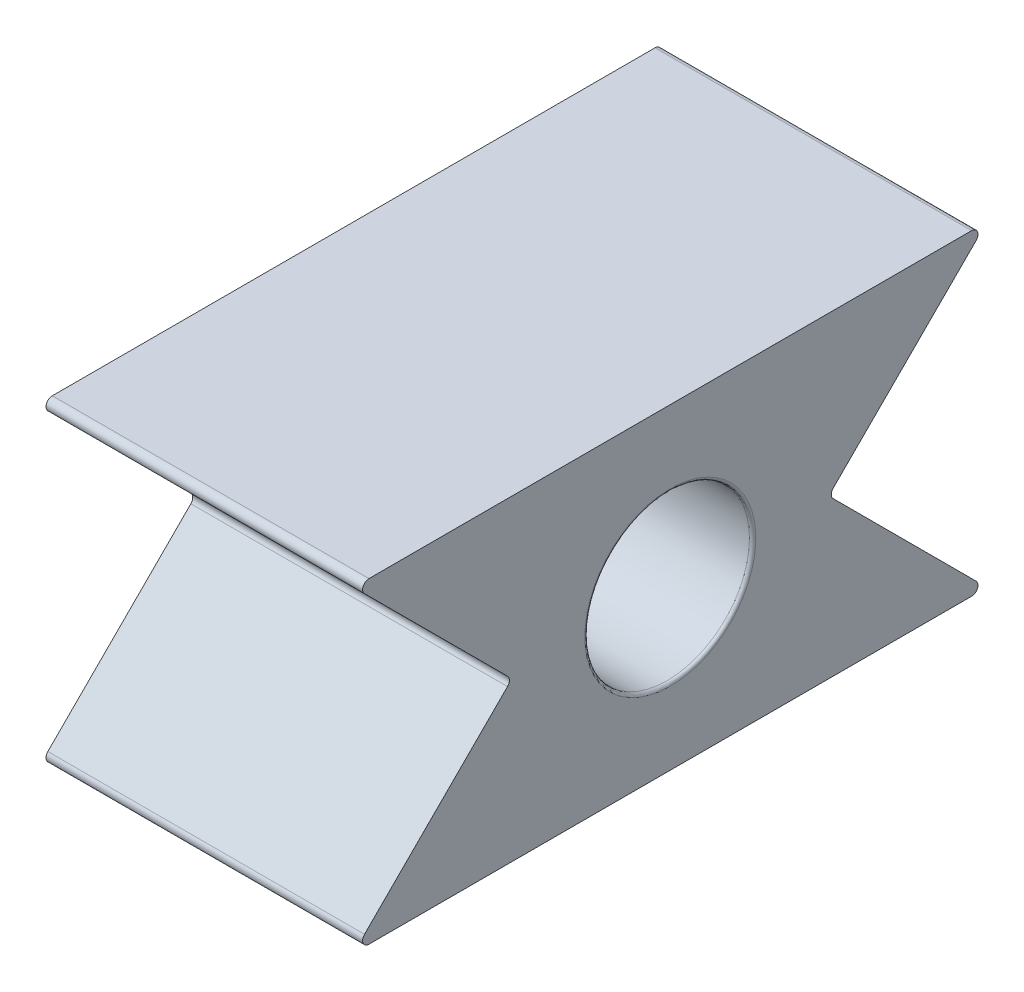
ISO-10303-21;
HEADER;
FILE_DESCRIPTION(('STEP AP214'),'2;1');
FILE_NAME('part.step','',(''),(''),'','','');
FILE_SCHEMA(('AUTOMOTIVE_DESIGN { 1 0 10303 214 1 1 1 1 }'));
ENDSEC;
DATA;
#1=APPLICATION_CONTEXT('core data for automotive mechanical design processes');
#2=APPLICATION_PROTOCOL_DEFINITION('international standard','automotive_design',2000,#1);
#3=PRODUCT_CONTEXT('',#1,'mechanical');
#4=PRODUCT('Part','Part','',(#3));
#5=PRODUCT_RELATED_PRODUCT_CATEGORY('part','',(#4));
#6=PRODUCT_DEFINITION_FORMATION('','',#4);
#7=PRODUCT_DEFINITION_CONTEXT('part definition',#1,'design');
#8=PRODUCT_DEFINITION('design','',#6,#7);
#9=PRODUCT_DEFINITION_SHAPE('','',#8);
#10=(LENGTH_UNIT() NAMED_UNIT(*) SI_UNIT(.MILLI.,.METRE.));
#11=(NAMED_UNIT(*) PLANE_ANGLE_UNIT() SI_UNIT($,.RADIAN.));
#12=(NAMED_UNIT(*) SI_UNIT($,.STERADIAN.) SOLID_ANGLE_UNIT());
#13=UNCERTAINTY_MEASURE_WITH_UNIT(LENGTH_MEASURE(1.E-05),#10,'distance_accuracy_value','');
#14=(GEOMETRIC_REPRESENTATION_CONTEXT(3) GLOBAL_UNCERTAINTY_ASSIGNED_CONTEXT((#13)) GLOBAL_UNIT_ASSIGNED_CONTEXT((#10,
#11,#12)) REPRESENTATION_CONTEXT('',''));
#15=CARTESIAN_POINT('',(0.,0.,0.));
#16=DIRECTION('',(0.,0.,1.));
#17=DIRECTION('',(1.,0.,0.));
#18=AXIS2_PLACEMENT_3D('',#15,#16,#17);
#19=CARTESIAN_POINT('',(10.,0.,0.));
#20=DIRECTION('',(-1.,0.,0.));
#21=DIRECTION('',(0.,0.,1.));
#22=AXIS2_PLACEMENT_3D('',#19,#20,#21);
#23=PLANE('',#22);
#24=CARTESIAN_POINT('',(10.,0.,0.));
#25=DIRECTION('',(-1.,0.,0.));
#26=DIRECTION('',(0.,0.,1.));
#27=AXIS2_PLACEMENT_3D('',#24,#25,#26);
#28=CIRCLE('',#27,2.7);
#29=CARTESIAN_POINT('',(10.,0.,2.7));
#30=VERTEX_POINT('',#29);
#31=EDGE_CURVE('E11',#30,#30,#28,.T.);
#32=ORIENTED_EDGE('',*,*,#31,.T.);
#33=EDGE_LOOP('',(#32));
#34=FACE_BOUND('',#33,.T.);
#35=DIRECTION('',(0.,0.,-1.));
#36=VECTOR('',#35,1.);
#37=CARTESIAN_POINT('',(10.,-5.,10.));
#38=LINE('',#37,#36);
#39=CARTESIAN_POINT('',(10.,-5.,9.51715730458879));
#40=VERTEX_POINT('',#39);
#41=CARTESIAN_POINT('',(10.,-5.,-9.51715727046197));
#42=VERTEX_POINT('',#41);
#43=EDGE_CURVE('E331',#40,#42,#38,.T.);
#44=ORIENTED_EDGE('',*,*,#43,.T.);
#45=CARTESIAN_POINT('',(10.,-4.8,-9.51715727046197));
#46=DIRECTION('',(-1.,0.,0.));
#47=DIRECTION('',(0.,0.,1.));
#48=AXIS2_PLACEMENT_3D('',#45,#46,#47);
#49=CIRCLE('',#48,0.2);
#50=CARTESIAN_POINT('',(10.,-4.65857864022875,-9.65857862316533));
#51=VERTEX_POINT('',#50);
#52=EDGE_CURVE('E236',#42,#51,#49,.F.);
#53=ORIENTED_EDGE('',*,*,#52,.T.);
#54=DIRECTION('',(0.,0.707106763516806,0.707106798856288));
#55=VECTOR('',#54,1.);
#56=CARTESIAN_POINT('',(10.,-5.,-10.));
#57=LINE('',#56,#55);
#58=CARTESIAN_POINT('',(10.,-0.141421359771257,-5.14142111695127));
#59=VERTEX_POINT('',#58);
#60=EDGE_CURVE('E172',#51,#59,#57,.T.);
#61=ORIENTED_EDGE('',*,*,#60,.T.);
#62=CARTESIAN_POINT('',(10.,0.,-5.28284246965463));
#63=DIRECTION('',(-1.,0.,0.));
#64=DIRECTION('',(0.,0.,1.));
#65=AXIS2_PLACEMENT_3D('',#62,#63,#64);
#66=CIRCLE('',#65,0.2);
#67=CARTESIAN_POINT('',(10.,0.141421359771258,-5.14142111695127));
#68=VERTEX_POINT('',#67);
#69=EDGE_CURVE('E148',#59,#68,#66,.T.);
#70=ORIENTED_EDGE('',*,*,#69,.T.);
#71=DIRECTION('',(0.,0.707106763516806,-0.707106798856288));
#72=VECTOR('',#71,1.);
#73=CARTESIAN_POINT('',(10.,0.,-4.99999975011212));
#74=LINE('',#73,#72);
#75=CARTESIAN_POINT('',(10.,4.65857864022874,-9.65857862316533));
#76=VERTEX_POINT('',#75);
#77=EDGE_CURVE('E157',#68,#76,#74,.T.);
#78=ORIENTED_EDGE('',*,*,#77,.T.);
#79=CARTESIAN_POINT('',(10.,4.8,-9.51715727046197));
#80=DIRECTION('',(-1.,0.,0.));
#81=DIRECTION('',(0.,0.,1.));
#82=AXIS2_PLACEMENT_3D('',#79,#80,#81);
#83=CIRCLE('',#82,0.2);
#84=CARTESIAN_POINT('',(10.,5.,-9.51715727046197));
#85=VERTEX_POINT('',#84);
#86=EDGE_CURVE('E68',#76,#85,#83,.F.);
#87=ORIENTED_EDGE('',*,*,#86,.T.);
#88=DIRECTION('',(0.,0.,1.));
#89=VECTOR('',#88,1.);
#90=CARTESIAN_POINT('',(10.,5.,-10.));
#91=LINE('',#90,#89);
#92=CARTESIAN_POINT('',(10.,5.,9.51715730458879));
#93=VERTEX_POINT('',#92);
#94=EDGE_CURVE('E347',#85,#93,#91,.T.);
#95=ORIENTED_EDGE('',*,*,#94,.T.);
#96=CARTESIAN_POINT('',(10.,4.8,9.51715730458879));
#97=DIRECTION('',(-1.,0.,0.));
#98=DIRECTION('',(0.,0.,1.));
#99=AXIS2_PLACEMENT_3D('',#96,#97,#98);
#100=CIRCLE('',#99,0.2);
#101=CARTESIAN_POINT('',(10.,4.65857864729664,9.65857866436005));
#102=VERTEX_POINT('',#101);
#103=EDGE_CURVE('E231',#93,#102,#100,.F.);
#104=ORIENTED_EDGE('',*,*,#103,.T.);
#105=DIRECTION('',(0.,-0.70710679885629,-0.707106763516805));
#106=VECTOR('',#105,1.);
#107=CARTESIAN_POINT('',(10.,5.,10.));
#108=LINE('',#107,#106);
#109=CARTESIAN_POINT('',(10.,0.141421352703361,5.14142159552335));
#110=VERTEX_POINT('',#109);
#111=EDGE_CURVE('E341',#102,#110,#108,.T.);
#112=ORIENTED_EDGE('',*,*,#111,.T.);
#113=CARTESIAN_POINT('',(10.,0.,5.28284295529461));
#114=DIRECTION('',(-1.,0.,0.));
#115=DIRECTION('',(0.,0.,1.));
#116=AXIS2_PLACEMENT_3D('',#113,#114,#115);
#117=CIRCLE('',#116,0.2);
#118=CARTESIAN_POINT('',(10.,-0.141421352703361,5.14142159552335));
#119=VERTEX_POINT('',#118);
#120=EDGE_CURVE('E249',#110,#119,#117,.T.);
#121=ORIENTED_EDGE('',*,*,#120,.T.);
#122=DIRECTION('',(0.,-0.70710679885629,0.707106763516805));
#123=VECTOR('',#122,1.);
#124=CARTESIAN_POINT('',(10.,0.,5.00000024988788));
#125=LINE('',#124,#123);
#126=CARTESIAN_POINT('',(10.,-4.65857864729664,9.65857866436005));
#127=VERTEX_POINT('',#126);
#128=EDGE_CURVE('E334',#119,#127,#125,.T.);
#129=ORIENTED_EDGE('',*,*,#128,.T.);
#130=CARTESIAN_POINT('',(10.,-4.8,9.51715730458879));
#131=DIRECTION('',(-1.,0.,0.));
#132=DIRECTION('',(0.,0.,1.));
#133=AXIS2_PLACEMENT_3D('',#130,#131,#132);
#134=CIRCLE('',#133,0.2);
#135=EDGE_CURVE('E228',#127,#40,#134,.F.);
#136=ORIENTED_EDGE('',*,*,#135,.T.);
#137=EDGE_LOOP('',(#44,#53,#61,#70,#78,#87,#95,#104,#112,#121,#129,#136));
#138=FACE_BOUND('',#137,.T.);
#139=ADVANCED_FACE('F45',(#34,#138),#23,.F.);
#140=CARTESIAN_POINT('',(0.,0.,0.));
#141=DIRECTION('',(-1.,0.,0.));
#142=DIRECTION('',(0.,0.,1.));
#143=AXIS2_PLACEMENT_3D('',#140,#141,#142);
#144=PLANE('',#143);
#145=CARTESIAN_POINT('',(0.,0.,0.));
#146=DIRECTION('',(-1.,0.,0.));
#147=DIRECTION('',(0.,0.,1.));
#148=AXIS2_PLACEMENT_3D('',#145,#146,#147);
#149=CIRCLE('',#148,2.7);
#150=CARTESIAN_POINT('',(0.,0.,2.7));
#151=VERTEX_POINT('',#150);
#152=EDGE_CURVE('E252',#151,#151,#149,.F.);
#153=ORIENTED_EDGE('',*,*,#152,.T.);
#154=EDGE_LOOP('',(#153));
#155=FACE_BOUND('',#154,.T.);
#156=DIRECTION('',(0.,0.707106763516806,0.707106798856288));
#157=VECTOR('',#156,1.);
#158=CARTESIAN_POINT('',(0.,-5.,-10.));
#159=LINE('',#158,#157);
#160=CARTESIAN_POINT('',(0.,-4.65857864022875,-9.65857862316533));
#161=VERTEX_POINT('',#160);
#162=CARTESIAN_POINT('',(0.,-0.141421359771257,-5.14142111695127));
#163=VERTEX_POINT('',#162);
#164=EDGE_CURVE('E186',#161,#163,#159,.T.);
#165=ORIENTED_EDGE('',*,*,#164,.F.);
#166=CARTESIAN_POINT('',(0.,-4.8,-9.51715727046197));
#167=DIRECTION('',(-1.,0.,0.));
#168=DIRECTION('',(0.,0.,1.));
#169=AXIS2_PLACEMENT_3D('',#166,#167,#168);
#170=CIRCLE('',#169,0.2);
#171=CARTESIAN_POINT('',(0.,-5.,-9.51715727046197));
#172=VERTEX_POINT('',#171);
#173=EDGE_CURVE('E218',#161,#172,#170,.T.);
#174=ORIENTED_EDGE('',*,*,#173,.T.);
#175=DIRECTION('',(0.,0.,-1.));
#176=VECTOR('',#175,1.);
#177=CARTESIAN_POINT('',(0.,-5.,10.));
#178=LINE('',#177,#176);
#179=CARTESIAN_POINT('',(0.,-5.,9.51715730458879));
#180=VERTEX_POINT('',#179);
#181=EDGE_CURVE('E182',#180,#172,#178,.T.);
#182=ORIENTED_EDGE('',*,*,#181,.F.);
#183=CARTESIAN_POINT('',(0.,-4.8,9.51715730458879));
#184=DIRECTION('',(-1.,0.,0.));
#185=DIRECTION('',(0.,0.,1.));
#186=AXIS2_PLACEMENT_3D('',#183,#184,#185);
#187=CIRCLE('',#186,0.2);
#188=CARTESIAN_POINT('',(0.,-4.65857864729664,9.65857866436005));
#189=VERTEX_POINT('',#188);
#190=EDGE_CURVE('E210',#180,#189,#187,.T.);
#191=ORIENTED_EDGE('',*,*,#190,.T.);
#192=DIRECTION('',(0.,-0.70710679885629,0.707106763516805));
#193=VECTOR('',#192,1.);
#194=CARTESIAN_POINT('',(0.,0.,5.00000024988788));
#195=LINE('',#194,#193);
#196=CARTESIAN_POINT('',(0.,-0.141421352703361,5.14142159552335));
#197=VERTEX_POINT('',#196);
#198=EDGE_CURVE('E178',#197,#189,#195,.T.);
#199=ORIENTED_EDGE('',*,*,#198,.F.);
#200=CARTESIAN_POINT('',(0.,0.,5.28284295529461));
#201=DIRECTION('',(-1.,0.,0.));
#202=DIRECTION('',(0.,0.,1.));
#203=AXIS2_PLACEMENT_3D('',#200,#201,#202);
#204=CIRCLE('',#203,0.2);
#205=CARTESIAN_POINT('',(0.,0.141421352703361,5.14142159552335));
#206=VERTEX_POINT('',#205);
#207=EDGE_CURVE('E246',#197,#206,#204,.F.);
#208=ORIENTED_EDGE('',*,*,#207,.T.);
#209=DIRECTION('',(0.,-0.70710679885629,-0.707106763516805));
#210=VECTOR('',#209,1.);
#211=CARTESIAN_POINT('',(0.,5.,10.));
#212=LINE('',#211,#210);
#213=CARTESIAN_POINT('',(0.,4.65857864729664,9.65857866436005));
#214=VERTEX_POINT('',#213);
#215=EDGE_CURVE('E169',#214,#206,#212,.T.);
#216=ORIENTED_EDGE('',*,*,#215,.F.);
#217=CARTESIAN_POINT('',(0.,4.8,9.51715730458879));
#218=DIRECTION('',(-1.,0.,0.));
#219=DIRECTION('',(0.,0.,1.));
#220=AXIS2_PLACEMENT_3D('',#217,#218,#219);
#221=CIRCLE('',#220,0.2);
#222=CARTESIAN_POINT('',(0.,5.,9.51715730458879));
#223=VERTEX_POINT('',#222);
#224=EDGE_CURVE('E213',#214,#223,#221,.T.);
#225=ORIENTED_EDGE('',*,*,#224,.T.);
#226=DIRECTION('',(0.,0.,1.));
#227=VECTOR('',#226,1.);
#228=CARTESIAN_POINT('',(0.,5.,-10.));
#229=LINE('',#228,#227);
#230=CARTESIAN_POINT('',(0.,5.,-9.51715727046197));
#231=VERTEX_POINT('',#230);
#232=EDGE_CURVE('E166',#231,#223,#229,.T.);
#233=ORIENTED_EDGE('',*,*,#232,.F.);
#234=CARTESIAN_POINT('',(0.,4.8,-9.51715727046197));
#235=DIRECTION('',(-1.,0.,0.));
#236=DIRECTION('',(0.,0.,1.));
#237=AXIS2_PLACEMENT_3D('',#234,#235,#236);
#238=CIRCLE('',#237,0.2);
#239=CARTESIAN_POINT('',(0.,4.65857864022874,-9.65857862316533));
#240=VERTEX_POINT('',#239);
#241=EDGE_CURVE('E164',#231,#240,#238,.T.);
#242=ORIENTED_EDGE('',*,*,#241,.T.);
#243=DIRECTION('',(0.,0.707106763516806,-0.707106798856288));
#244=VECTOR('',#243,1.);
#245=CARTESIAN_POINT('',(0.,0.,-4.99999975011212));
#246=LINE('',#245,#244);
#247=CARTESIAN_POINT('',(0.,0.141421359771258,-5.14142111695127));
#248=VERTEX_POINT('',#247);
#249=EDGE_CURVE('E155',#248,#240,#246,.T.);
#250=ORIENTED_EDGE('',*,*,#249,.F.);
#251=CARTESIAN_POINT('',(0.,0.,-5.28284246965463));
#252=DIRECTION('',(-1.,0.,0.));
#253=DIRECTION('',(0.,0.,1.));
#254=AXIS2_PLACEMENT_3D('',#251,#252,#253);
#255=CIRCLE('',#254,0.2);
#256=EDGE_CURVE('E137',#248,#163,#255,.F.);
#257=ORIENTED_EDGE('',*,*,#256,.T.);
#258=EDGE_LOOP('',(#165,#174,#182,#191,#199,#208,#216,#225,#233,#242,#250,#257));
#259=FACE_BOUND('',#258,.T.);
#260=ADVANCED_FACE('F162',(#155,#259),#144,.T.);
#261=CARTESIAN_POINT('',(10.,0.,-4.99999975011212));
#262=DIRECTION('',(0.,0.707106798856288,0.707106763516806));
#263=DIRECTION('',(0.,-0.707106763516806,0.707106798856288));
#264=AXIS2_PLACEMENT_3D('',#261,#262,#263);
#265=PLANE('',#264);
#266=ORIENTED_EDGE('',*,*,#77,.F.);
#267=DIRECTION('',(-1.,0.,0.));
#268=VECTOR('',#267,1.);
#269=CARTESIAN_POINT('',(0.,0.141421359771258,-5.14142111695127));
#270=LINE('',#269,#268);
#271=EDGE_CURVE('E141',#68,#248,#270,.T.);
#272=ORIENTED_EDGE('',*,*,#271,.T.);
#273=ORIENTED_EDGE('',*,*,#249,.T.);
#274=DIRECTION('',(-1.,0.,0.));
#275=VECTOR('',#274,1.);
#276=CARTESIAN_POINT('',(10.,4.65857864022874,-9.65857862316533));
#277=LINE('',#276,#275);
#278=EDGE_CURVE('E160',#240,#76,#277,.F.);
#279=ORIENTED_EDGE('',*,*,#278,.T.);
#280=EDGE_LOOP('',(#266,#272,#273,#279));
#281=FACE_BOUND('',#280,.T.);
#282=ADVANCED_FACE('F154',(#281),#265,.F.);
#283=CARTESIAN_POINT('',(10.,5.,-10.));
#284=DIRECTION('',(0.,-1.,0.));
#285=DIRECTION('',(0.,0.,-1.));
#286=AXIS2_PLACEMENT_3D('',#283,#284,#285);
#287=PLANE('',#286);
#288=ORIENTED_EDGE('',*,*,#94,.F.);
#289=DIRECTION('',(-1.,0.,0.));
#290=VECTOR('',#289,1.);
#291=CARTESIAN_POINT('',(10.,5.,-9.51715727046197));
#292=LINE('',#291,#290);
#293=EDGE_CURVE('E149',#85,#231,#292,.T.);
#294=ORIENTED_EDGE('',*,*,#293,.T.);
#295=ORIENTED_EDGE('',*,*,#232,.T.);
#296=DIRECTION('',(-1.,0.,0.));
#297=VECTOR('',#296,1.);
#298=CARTESIAN_POINT('',(10.,5.,9.51715730458879));
#299=LINE('',#298,#297);
#300=EDGE_CURVE('E61',#223,#93,#299,.F.);
#301=ORIENTED_EDGE('',*,*,#300,.T.);
#302=EDGE_LOOP('',(#288,#294,#295,#301));
#303=FACE_BOUND('',#302,.T.);
#304=ADVANCED_FACE('F279',(#303),#287,.F.);
#305=CARTESIAN_POINT('',(10.,5.,10.));
#306=DIRECTION('',(0.,0.707106763516805,-0.70710679885629));
#307=DIRECTION('',(0.,0.70710679885629,0.707106763516805));
#308=AXIS2_PLACEMENT_3D('',#305,#306,#307);
#309=PLANE('',#308);
#310=ORIENTED_EDGE('',*,*,#215,.T.);
#311=DIRECTION('',(-1.,0.,0.));
#312=VECTOR('',#311,1.);
#313=CARTESIAN_POINT('',(10.,0.141421352703361,5.14142159552335));
#314=LINE('',#313,#312);
#315=EDGE_CURVE('E207',#206,#110,#314,.F.);
#316=ORIENTED_EDGE('',*,*,#315,.T.);
#317=ORIENTED_EDGE('',*,*,#111,.F.);
#318=DIRECTION('',(-1.,0.,0.));
#319=VECTOR('',#318,1.);
#320=CARTESIAN_POINT('',(10.,4.65857864729664,9.65857866436005));
#321=LINE('',#320,#319);
#322=EDGE_CURVE('E203',#102,#214,#321,.T.);
#323=ORIENTED_EDGE('',*,*,#322,.T.);
#324=EDGE_LOOP('',(#310,#316,#317,#323));
#325=FACE_BOUND('',#324,.T.);
#326=ADVANCED_FACE('F296',(#325),#309,.F.);
#327=CARTESIAN_POINT('',(10.,0.,5.00000024988788));
#328=DIRECTION('',(0.,-0.707106763516805,-0.70710679885629));
#329=DIRECTION('',(0.,0.70710679885629,-0.707106763516805));
#330=AXIS2_PLACEMENT_3D('',#327,#328,#329);
#331=PLANE('',#330);
#332=ORIENTED_EDGE('',*,*,#128,.F.);
#333=DIRECTION('',(-1.,0.,0.));
#334=VECTOR('',#333,1.);
#335=CARTESIAN_POINT('',(0.,-0.141421352703361,5.14142159552335));
#336=LINE('',#335,#334);
#337=EDGE_CURVE('E199',#119,#197,#336,.T.);
#338=ORIENTED_EDGE('',*,*,#337,.T.);
#339=ORIENTED_EDGE('',*,*,#198,.T.);
#340=DIRECTION('',(-1.,0.,0.));
#341=VECTOR('',#340,1.);
#342=CARTESIAN_POINT('',(10.,-4.65857864729664,9.65857866436005));
#343=LINE('',#342,#341);
#344=EDGE_CURVE('E196',#189,#127,#343,.F.);
#345=ORIENTED_EDGE('',*,*,#344,.T.);
#346=EDGE_LOOP('',(#332,#338,#339,#345));
#347=FACE_BOUND('',#346,.T.);
#348=ADVANCED_FACE('F292',(#347),#331,.F.);
#349=CARTESIAN_POINT('',(10.,-5.,10.));
#350=DIRECTION('',(0.,1.,0.));
#351=DIRECTION('',(0.,0.,1.));
#352=AXIS2_PLACEMENT_3D('',#349,#350,#351);
#353=PLANE('',#352);
#354=ORIENTED_EDGE('',*,*,#181,.T.);
#355=DIRECTION('',(-1.,0.,0.));
#356=VECTOR('',#355,1.);
#357=CARTESIAN_POINT('',(10.,-5.,-9.51715727046197));
#358=LINE('',#357,#356);
#359=EDGE_CURVE('E225',#172,#42,#358,.F.);
#360=ORIENTED_EDGE('',*,*,#359,.T.);
#361=ORIENTED_EDGE('',*,*,#43,.F.);
#362=DIRECTION('',(-1.,0.,0.));
#363=VECTOR('',#362,1.);
#364=CARTESIAN_POINT('',(10.,-5.,9.51715730458879));
#365=LINE('',#364,#363);
#366=EDGE_CURVE('E221',#40,#180,#365,.T.);
#367=ORIENTED_EDGE('',*,*,#366,.T.);
#368=EDGE_LOOP('',(#354,#360,#361,#367));
#369=FACE_BOUND('',#368,.T.);
#370=ADVANCED_FACE('F288',(#369),#353,.F.);
#371=CARTESIAN_POINT('',(10.,-5.,-10.));
#372=DIRECTION('',(0.,-0.707106798856288,0.707106763516806));
#373=DIRECTION('',(0.,-0.707106763516806,-0.707106798856288));
#374=AXIS2_PLACEMENT_3D('',#371,#372,#373);
#375=PLANE('',#374);
#376=ORIENTED_EDGE('',*,*,#164,.T.);
#377=DIRECTION('',(-1.,0.,0.));
#378=VECTOR('',#377,1.);
#379=CARTESIAN_POINT('',(10.,-0.141421359771258,-5.14142111695127));
#380=LINE('',#379,#378);
#381=EDGE_CURVE('E142',#163,#59,#380,.F.);
#382=ORIENTED_EDGE('',*,*,#381,.T.);
#383=ORIENTED_EDGE('',*,*,#60,.F.);
#384=DIRECTION('',(-1.,0.,0.));
#385=VECTOR('',#384,1.);
#386=CARTESIAN_POINT('',(10.,-4.65857864022875,-9.65857862316533));
#387=LINE('',#386,#385);
#388=EDGE_CURVE('E159',#51,#161,#387,.T.);
#389=ORIENTED_EDGE('',*,*,#388,.T.);
#390=EDGE_LOOP('',(#376,#382,#383,#389));
#391=FACE_BOUND('',#390,.T.);
#392=ADVANCED_FACE('F285',(#391),#375,.F.);
#393=CARTESIAN_POINT('',(10.,0.,0.));
#394=DIRECTION('',(-1.,0.,0.));
#395=DIRECTION('',(0.,0.,1.));
#396=AXIS2_PLACEMENT_3D('',#393,#394,#395);
#397=CYLINDRICAL_SURFACE('',#396,2.6);
#398=CARTESIAN_POINT('',(0.0999999999999994,0.,0.));
#399=DIRECTION('',(-1.,0.,0.));
#400=DIRECTION('',(0.,0.,1.));
#401=AXIS2_PLACEMENT_3D('',#398,#399,#400);
#402=CIRCLE('',#401,2.6);
#403=CARTESIAN_POINT('',(0.0999999999999994,0.,2.6));
#404=VERTEX_POINT('',#403);
#405=EDGE_CURVE('E54',#404,#404,#402,.T.);
#406=ORIENTED_EDGE('',*,*,#405,.T.);
#407=EDGE_LOOP('',(#406));
#408=FACE_BOUND('',#407,.T.);
#409=CARTESIAN_POINT('',(9.9,0.,0.));
#410=DIRECTION('',(-1.,0.,0.));
#411=DIRECTION('',(0.,0.,1.));
#412=AXIS2_PLACEMENT_3D('',#409,#410,#411);
#413=CIRCLE('',#412,2.6);
#414=CARTESIAN_POINT('',(9.9,0.,2.6));
#415=VERTEX_POINT('',#414);
#416=EDGE_CURVE('E256',#415,#415,#413,.F.);
#417=ORIENTED_EDGE('',*,*,#416,.T.);
#418=EDGE_LOOP('',(#417));
#419=FACE_BOUND('',#418,.T.);
#420=ADVANCED_FACE('F263',(#408,#419),#397,.F.);
#421=CARTESIAN_POINT('',(10.,0.,-5.28284246965463));
#422=DIRECTION('',(1.,0.,0.));
#423=DIRECTION('',(0.,0.,-1.));
#424=AXIS2_PLACEMENT_3D('',#421,#422,#423);
#425=CYLINDRICAL_SURFACE('',#424,0.2);
#426=ORIENTED_EDGE('',*,*,#69,.F.);
#427=ORIENTED_EDGE('',*,*,#381,.F.);
#428=ORIENTED_EDGE('',*,*,#256,.F.);
#429=ORIENTED_EDGE('',*,*,#271,.F.);
#430=EDGE_LOOP('',(#426,#427,#428,#429));
#431=FACE_BOUND('',#430,.T.);
#432=ADVANCED_FACE('F140',(#431),#425,.F.);
#433=CARTESIAN_POINT('',(10.,0.,5.28284295529461));
#434=DIRECTION('',(1.,0.,0.));
#435=DIRECTION('',(0.,0.,-1.));
#436=AXIS2_PLACEMENT_3D('',#433,#434,#435);
#437=CYLINDRICAL_SURFACE('',#436,0.2);
#438=ORIENTED_EDGE('',*,*,#120,.F.);
#439=ORIENTED_EDGE('',*,*,#315,.F.);
#440=ORIENTED_EDGE('',*,*,#207,.F.);
#441=ORIENTED_EDGE('',*,*,#337,.F.);
#442=EDGE_LOOP('',(#438,#439,#440,#441));
#443=FACE_BOUND('',#442,.T.);
#444=ADVANCED_FACE('F305',(#443),#437,.F.);
#445=CARTESIAN_POINT('',(10.,-4.8,-9.51715727046197));
#446=DIRECTION('',(-1.,0.,0.));
#447=DIRECTION('',(0.,0.,1.));
#448=AXIS2_PLACEMENT_3D('',#445,#446,#447);
#449=CYLINDRICAL_SURFACE('',#448,0.2);
#450=ORIENTED_EDGE('',*,*,#52,.F.);
#451=ORIENTED_EDGE('',*,*,#359,.F.);
#452=ORIENTED_EDGE('',*,*,#173,.F.);
#453=ORIENTED_EDGE('',*,*,#388,.F.);
#454=EDGE_LOOP('',(#450,#451,#452,#453));
#455=FACE_BOUND('',#454,.T.);
#456=ADVANCED_FACE('F308',(#455),#449,.T.);
#457=CARTESIAN_POINT('',(10.,4.8,-9.51715727046197));
#458=DIRECTION('',(-1.,0.,0.));
#459=DIRECTION('',(0.,0.,1.));
#460=AXIS2_PLACEMENT_3D('',#457,#458,#459);
#461=CYLINDRICAL_SURFACE('',#460,0.2);
#462=ORIENTED_EDGE('',*,*,#86,.F.);
#463=ORIENTED_EDGE('',*,*,#278,.F.);
#464=ORIENTED_EDGE('',*,*,#241,.F.);
#465=ORIENTED_EDGE('',*,*,#293,.F.);
#466=EDGE_LOOP('',(#462,#463,#464,#465));
#467=FACE_BOUND('',#466,.T.);
#468=ADVANCED_FACE('F312',(#467),#461,.T.);
#469=CARTESIAN_POINT('',(10.,4.8,9.51715730458879));
#470=DIRECTION('',(-1.,0.,0.));
#471=DIRECTION('',(0.,0.,1.));
#472=AXIS2_PLACEMENT_3D('',#469,#470,#471);
#473=CYLINDRICAL_SURFACE('',#472,0.2);
#474=ORIENTED_EDGE('',*,*,#103,.F.);
#475=ORIENTED_EDGE('',*,*,#300,.F.);
#476=ORIENTED_EDGE('',*,*,#224,.F.);
#477=ORIENTED_EDGE('',*,*,#322,.F.);
#478=EDGE_LOOP('',(#474,#475,#476,#477));
#479=FACE_BOUND('',#478,.T.);
#480=ADVANCED_FACE('F316',(#479),#473,.T.);
#481=CARTESIAN_POINT('',(10.,-4.8,9.51715730458879));
#482=DIRECTION('',(-1.,0.,0.));
#483=DIRECTION('',(0.,0.,1.));
#484=AXIS2_PLACEMENT_3D('',#481,#482,#483);
#485=CYLINDRICAL_SURFACE('',#484,0.2);
#486=ORIENTED_EDGE('',*,*,#135,.F.);
#487=ORIENTED_EDGE('',*,*,#344,.F.);
#488=ORIENTED_EDGE('',*,*,#190,.F.);
#489=ORIENTED_EDGE('',*,*,#366,.F.);
#490=EDGE_LOOP('',(#486,#487,#488,#489));
#491=FACE_BOUND('',#490,.T.);
#492=ADVANCED_FACE('F269',(#491),#485,.T.);
#493=CARTESIAN_POINT('',(0.0999999999999994,0.,0.));
#494=DIRECTION('',(-1.,0.,0.));
#495=DIRECTION('',(0.,0.,1.));
#496=AXIS2_PLACEMENT_3D('',#493,#494,#495);
#497=TOROIDAL_SURFACE('',#496,2.7,0.1);
#498=ORIENTED_EDGE('',*,*,#405,.F.);
#499=EDGE_LOOP('',(#498));
#500=FACE_BOUND('',#499,.T.);
#501=ORIENTED_EDGE('',*,*,#152,.F.);
#502=EDGE_LOOP('',(#501));
#503=FACE_BOUND('',#502,.T.);
#504=ADVANCED_FACE('F266',(#500,#503),#497,.T.);
#505=CARTESIAN_POINT('',(9.9,0.,0.));
#506=DIRECTION('',(-1.,0.,0.));
#507=DIRECTION('',(0.,0.,1.));
#508=AXIS2_PLACEMENT_3D('',#505,#506,#507);
#509=TOROIDAL_SURFACE('',#508,2.7,0.1);
#510=ORIENTED_EDGE('',*,*,#31,.F.);
#511=EDGE_LOOP('',(#510));
#512=FACE_BOUND('',#511,.T.);
#513=ORIENTED_EDGE('',*,*,#416,.F.);
#514=EDGE_LOOP('',(#513));
#515=FACE_BOUND('',#514,.T.);
#516=ADVANCED_FACE('F47',(#512,#515),#509,.T.);
#517=CLOSED_SHELL('',(#139,#260,#282,#304,#326,#348,#370,#392,#420,#432,#444,#456,#468,#480,
#492,#504,#516));
#518=MANIFOLD_SOLID_BREP('B2',#517);
#519=ADVANCED_BREP_SHAPE_REPRESENTATION('',(#18,#518),#14);
#520=SHAPE_DEFINITION_REPRESENTATION(#9,#519);
ENDSEC;
END-ISO-10303-21;
